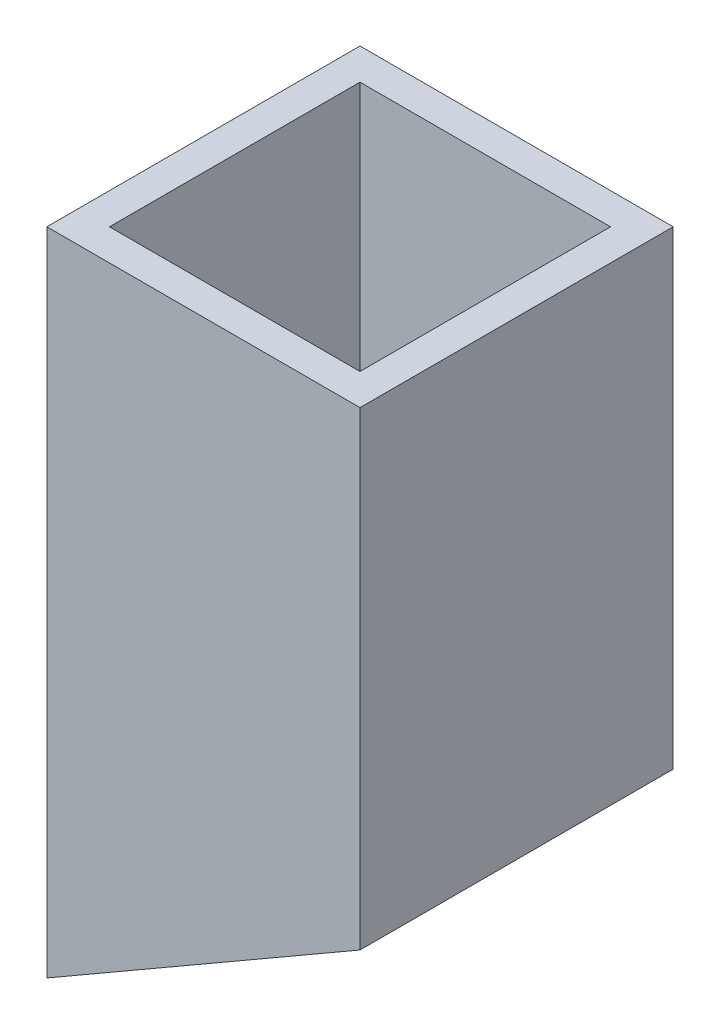
ISO-10303-21;
HEADER;
FILE_DESCRIPTION(('STEP AP214'),'2;1');
FILE_NAME('part.step','',(''),(''),'','','');
FILE_SCHEMA(('AUTOMOTIVE_DESIGN { 1 0 10303 214 1 1 1 1 }'));
ENDSEC;
DATA;
#1=APPLICATION_CONTEXT('core data for automotive mechanical design processes');
#2=APPLICATION_PROTOCOL_DEFINITION('international standard','automotive_design',2000,#1);
#3=PRODUCT_CONTEXT('',#1,'mechanical');
#4=PRODUCT('Part','Part','',(#3));
#5=PRODUCT_RELATED_PRODUCT_CATEGORY('part','',(#4));
#6=PRODUCT_DEFINITION_FORMATION('','',#4);
#7=PRODUCT_DEFINITION_CONTEXT('part definition',#1,'design');
#8=PRODUCT_DEFINITION('design','',#6,#7);
#9=PRODUCT_DEFINITION_SHAPE('','',#8);
#10=(LENGTH_UNIT() NAMED_UNIT(*) SI_UNIT(.MILLI.,.METRE.));
#11=(NAMED_UNIT(*) PLANE_ANGLE_UNIT() SI_UNIT($,.RADIAN.));
#12=(NAMED_UNIT(*) SI_UNIT($,.STERADIAN.) SOLID_ANGLE_UNIT());
#13=UNCERTAINTY_MEASURE_WITH_UNIT(LENGTH_MEASURE(1.E-05),#10,'distance_accuracy_value','');
#14=(GEOMETRIC_REPRESENTATION_CONTEXT(3) GLOBAL_UNCERTAINTY_ASSIGNED_CONTEXT((#13)) GLOBAL_UNIT_ASSIGNED_CONTEXT((#10,
#11,#12)) REPRESENTATION_CONTEXT('',''));
#15=CARTESIAN_POINT('',(0.,0.,0.));
#16=DIRECTION('',(0.,0.,1.));
#17=DIRECTION('',(1.,0.,0.));
#18=AXIS2_PLACEMENT_3D('',#15,#16,#17);
#19=CARTESIAN_POINT('',(0.,150.,0.));
#20=DIRECTION('',(0.,-1.,0.));
#21=DIRECTION('',(0.,0.,-1.));
#22=AXIS2_PLACEMENT_3D('',#19,#20,#21);
#23=PLANE('',#22);
#24=DIRECTION('',(0.,0.,1.));
#25=VECTOR('',#24,1.);
#26=CARTESIAN_POINT('',(0.,150.,0.));
#27=LINE('',#26,#25);
#28=CARTESIAN_POINT('',(0.,150.,-100.));
#29=VERTEX_POINT('',#28);
#30=CARTESIAN_POINT('',(0.,150.,0.));
#31=VERTEX_POINT('',#30);
#32=EDGE_CURVE('E93',#29,#31,#27,.T.);
#33=ORIENTED_EDGE('',*,*,#32,.T.);
#34=DIRECTION('',(1.,0.,0.));
#35=VECTOR('',#34,1.);
#36=CARTESIAN_POINT('',(0.,150.,0.));
#37=LINE('',#36,#35);
#38=CARTESIAN_POINT('',(100.,150.,0.));
#39=VERTEX_POINT('',#38);
#40=EDGE_CURVE('E87',#31,#39,#37,.T.);
#41=ORIENTED_EDGE('',*,*,#40,.T.);
#42=DIRECTION('',(0.,0.,-1.));
#43=VECTOR('',#42,1.);
#44=CARTESIAN_POINT('',(100.,150.,0.));
#45=LINE('',#44,#43);
#46=CARTESIAN_POINT('',(100.,150.,-100.));
#47=VERTEX_POINT('',#46);
#48=EDGE_CURVE('E90',#39,#47,#45,.T.);
#49=ORIENTED_EDGE('',*,*,#48,.T.);
#50=DIRECTION('',(-1.,0.,0.));
#51=VECTOR('',#50,1.);
#52=CARTESIAN_POINT('',(0.,150.,-100.));
#53=LINE('',#52,#51);
#54=EDGE_CURVE('E58',#47,#29,#53,.T.);
#55=ORIENTED_EDGE('',*,*,#54,.T.);
#56=EDGE_LOOP('',(#33,#41,#49,#55));
#57=FACE_BOUND('',#56,.T.);
#58=DIRECTION('',(0.,0.,1.));
#59=VECTOR('',#58,1.);
#60=CARTESIAN_POINT('',(10.,150.,0.));
#61=LINE('',#60,#59);
#62=CARTESIAN_POINT('',(9.99999999999998,150.,-90.));
#63=VERTEX_POINT('',#62);
#64=CARTESIAN_POINT('',(10.,150.,-10.));
#65=VERTEX_POINT('',#64);
#66=EDGE_CURVE('E128',#63,#65,#61,.T.);
#67=ORIENTED_EDGE('',*,*,#66,.F.);
#68=DIRECTION('',(-1.,0.,0.));
#69=VECTOR('',#68,1.);
#70=CARTESIAN_POINT('',(0.,150.,-90.));
#71=LINE('',#70,#69);
#72=CARTESIAN_POINT('',(90.,150.,-90.));
#73=VERTEX_POINT('',#72);
#74=EDGE_CURVE('E120',#73,#63,#71,.T.);
#75=ORIENTED_EDGE('',*,*,#74,.F.);
#76=DIRECTION('',(0.,0.,-1.));
#77=VECTOR('',#76,1.);
#78=CARTESIAN_POINT('',(90.,150.,0.));
#79=LINE('',#78,#77);
#80=CARTESIAN_POINT('',(90.,150.,-10.));
#81=VERTEX_POINT('',#80);
#82=EDGE_CURVE('E123',#81,#73,#79,.T.);
#83=ORIENTED_EDGE('',*,*,#82,.F.);
#84=DIRECTION('',(1.,0.,0.));
#85=VECTOR('',#84,1.);
#86=CARTESIAN_POINT('',(0.,150.,-10.));
#87=LINE('',#86,#85);
#88=EDGE_CURVE('E125',#65,#81,#87,.T.);
#89=ORIENTED_EDGE('',*,*,#88,.F.);
#90=EDGE_LOOP('',(#67,#75,#83,#89));
#91=FACE_BOUND('',#90,.T.);
#92=ADVANCED_FACE('F34',(#57,#91),#23,.F.);
#93=CARTESIAN_POINT('',(0.,150.,0.));
#94=DIRECTION('',(1.,0.,0.));
#95=DIRECTION('',(0.,0.,-1.));
#96=AXIS2_PLACEMENT_3D('',#93,#94,#95);
#97=PLANE('',#96);
#98=DIRECTION('',(0.,-1.,0.));
#99=VECTOR('',#98,1.);
#100=CARTESIAN_POINT('',(0.,150.,-100.));
#101=LINE('',#100,#99);
#102=CARTESIAN_POINT('',(0.,-57.7350269189618,-100.));
#103=VERTEX_POINT('',#102);
#104=EDGE_CURVE('E103',#29,#103,#101,.T.);
#105=ORIENTED_EDGE('',*,*,#104,.T.);
#106=DIRECTION('',(0.,0.,1.));
#107=VECTOR('',#106,1.);
#108=CARTESIAN_POINT('',(0.,-57.7350269189618,-215.470053837925));
#109=LINE('',#108,#107);
#110=CARTESIAN_POINT('',(0.,-57.7350269189618,0.));
#111=VERTEX_POINT('',#110);
#112=EDGE_CURVE('E115',#103,#111,#109,.T.);
#113=ORIENTED_EDGE('',*,*,#112,.T.);
#114=DIRECTION('',(0.,-1.,0.));
#115=VECTOR('',#114,1.);
#116=CARTESIAN_POINT('',(0.,150.,0.));
#117=LINE('',#116,#115);
#118=EDGE_CURVE('E11',#31,#111,#117,.T.);
#119=ORIENTED_EDGE('',*,*,#118,.F.);
#120=ORIENTED_EDGE('',*,*,#32,.F.);
#121=EDGE_LOOP('',(#105,#113,#119,#120));
#122=FACE_BOUND('',#121,.T.);
#123=ADVANCED_FACE('F36',(#122),#97,.F.);
#124=CARTESIAN_POINT('',(0.,150.,0.));
#125=DIRECTION('',(0.,0.,-1.));
#126=DIRECTION('',(-1.,0.,0.));
#127=AXIS2_PLACEMENT_3D('',#124,#125,#126);
#128=PLANE('',#127);
#129=ORIENTED_EDGE('',*,*,#118,.T.);
#130=DIRECTION('',(0.866025403784442,0.499999999999995,0.));
#131=VECTOR('',#130,1.);
#132=CARTESIAN_POINT('',(0.,-57.7350269189618,0.));
#133=LINE('',#132,#131);
#134=CARTESIAN_POINT('',(100.,0.,0.));
#135=VERTEX_POINT('',#134);
#136=EDGE_CURVE('E70',#111,#135,#133,.T.);
#137=ORIENTED_EDGE('',*,*,#136,.T.);
#138=DIRECTION('',(0.,-1.,0.));
#139=VECTOR('',#138,1.);
#140=CARTESIAN_POINT('',(100.,150.,0.));
#141=LINE('',#140,#139);
#142=EDGE_CURVE('E42',#39,#135,#141,.T.);
#143=ORIENTED_EDGE('',*,*,#142,.F.);
#144=ORIENTED_EDGE('',*,*,#40,.F.);
#145=EDGE_LOOP('',(#129,#137,#143,#144));
#146=FACE_BOUND('',#145,.T.);
#147=ADVANCED_FACE('F97',(#146),#128,.F.);
#148=CARTESIAN_POINT('',(100.,150.,0.));
#149=DIRECTION('',(-1.,0.,0.));
#150=DIRECTION('',(0.,0.,1.));
#151=AXIS2_PLACEMENT_3D('',#148,#149,#150);
#152=PLANE('',#151);
#153=DIRECTION('',(0.,0.,-1.));
#154=VECTOR('',#153,1.);
#155=CARTESIAN_POINT('',(100.,0.,0.));
#156=LINE('',#155,#154);
#157=CARTESIAN_POINT('',(100.,0.,-100.));
#158=VERTEX_POINT('',#157);
#159=EDGE_CURVE('E107',#135,#158,#156,.T.);
#160=ORIENTED_EDGE('',*,*,#159,.T.);
#161=DIRECTION('',(0.,-1.,0.));
#162=VECTOR('',#161,1.);
#163=CARTESIAN_POINT('',(100.,150.,-100.));
#164=LINE('',#163,#162);
#165=EDGE_CURVE('E99',#47,#158,#164,.T.);
#166=ORIENTED_EDGE('',*,*,#165,.F.);
#167=ORIENTED_EDGE('',*,*,#48,.F.);
#168=ORIENTED_EDGE('',*,*,#142,.T.);
#169=EDGE_LOOP('',(#160,#166,#167,#168));
#170=FACE_BOUND('',#169,.T.);
#171=ADVANCED_FACE('F100',(#170),#152,.F.);
#172=CARTESIAN_POINT('',(0.,150.,-100.));
#173=DIRECTION('',(0.,0.,1.));
#174=DIRECTION('',(1.,0.,0.));
#175=AXIS2_PLACEMENT_3D('',#172,#173,#174);
#176=PLANE('',#175);
#177=ORIENTED_EDGE('',*,*,#165,.T.);
#178=DIRECTION('',(-0.866025403784442,-0.499999999999995,0.));
#179=VECTOR('',#178,1.);
#180=CARTESIAN_POINT('',(0.,-57.7350269189618,-100.));
#181=LINE('',#180,#179);
#182=EDGE_CURVE('E80',#158,#103,#181,.T.);
#183=ORIENTED_EDGE('',*,*,#182,.T.);
#184=ORIENTED_EDGE('',*,*,#104,.F.);
#185=ORIENTED_EDGE('',*,*,#54,.F.);
#186=EDGE_LOOP('',(#177,#183,#184,#185));
#187=FACE_BOUND('',#186,.T.);
#188=ADVANCED_FACE('F111',(#187),#176,.F.);
#189=CARTESIAN_POINT('',(0.,-57.7350269189618,-215.470053837925));
#190=DIRECTION('',(0.499999999999995,-0.866025403784441,0.));
#191=DIRECTION('',(0.866025403784442,0.499999999999995,0.));
#192=AXIS2_PLACEMENT_3D('',#189,#190,#191);
#193=PLANE('',#192);
#194=ORIENTED_EDGE('',*,*,#182,.F.);
#195=ORIENTED_EDGE('',*,*,#159,.F.);
#196=ORIENTED_EDGE('',*,*,#136,.F.);
#197=ORIENTED_EDGE('',*,*,#112,.F.);
#198=EDGE_LOOP('',(#194,#195,#196,#197));
#199=FACE_BOUND('',#198,.T.);
#200=ADVANCED_FACE('F183',(#199),#193,.T.);
#201=CARTESIAN_POINT('',(10.,150.,0.));
#202=DIRECTION('',(1.,0.,0.));
#203=DIRECTION('',(0.,0.,-1.));
#204=AXIS2_PLACEMENT_3D('',#201,#202,#203);
#205=PLANE('',#204);
#206=DIRECTION('',(0.,-1.,0.));
#207=VECTOR('',#206,1.);
#208=CARTESIAN_POINT('',(9.99999999999998,150.,-90.));
#209=LINE('',#208,#207);
#210=CARTESIAN_POINT('',(9.99999999999998,-40.4145188432732,-90.));
#211=VERTEX_POINT('',#210);
#212=EDGE_CURVE('E122',#63,#211,#209,.T.);
#213=ORIENTED_EDGE('',*,*,#212,.F.);
#214=ORIENTED_EDGE('',*,*,#66,.T.);
#215=DIRECTION('',(0.,-1.,0.));
#216=VECTOR('',#215,1.);
#217=CARTESIAN_POINT('',(10.,150.,-10.));
#218=LINE('',#217,#216);
#219=CARTESIAN_POINT('',(10.,-40.4145188432732,-10.));
#220=VERTEX_POINT('',#219);
#221=EDGE_CURVE('E118',#65,#220,#218,.T.);
#222=ORIENTED_EDGE('',*,*,#221,.T.);
#223=DIRECTION('',(0.,0.,1.));
#224=VECTOR('',#223,1.);
#225=CARTESIAN_POINT('',(9.99999999999994,-40.4145188432732,-215.470053837925));
#226=LINE('',#225,#224);
#227=EDGE_CURVE('E135',#211,#220,#226,.T.);
#228=ORIENTED_EDGE('',*,*,#227,.F.);
#229=EDGE_LOOP('',(#213,#214,#222,#228));
#230=FACE_BOUND('',#229,.T.);
#231=ADVANCED_FACE('F165',(#230),#205,.T.);
#232=CARTESIAN_POINT('',(0.,150.,-10.));
#233=DIRECTION('',(0.,0.,-1.));
#234=DIRECTION('',(-1.,0.,0.));
#235=AXIS2_PLACEMENT_3D('',#232,#233,#234);
#236=PLANE('',#235);
#237=ORIENTED_EDGE('',*,*,#221,.F.);
#238=ORIENTED_EDGE('',*,*,#88,.T.);
#239=DIRECTION('',(0.,-1.,0.));
#240=VECTOR('',#239,1.);
#241=CARTESIAN_POINT('',(90.,150.,-10.));
#242=LINE('',#241,#240);
#243=CARTESIAN_POINT('',(90.,5.77350269189631,-10.));
#244=VERTEX_POINT('',#243);
#245=EDGE_CURVE('E137',#81,#244,#242,.T.);
#246=ORIENTED_EDGE('',*,*,#245,.T.);
#247=DIRECTION('',(0.866025403784442,0.499999999999995,0.));
#248=VECTOR('',#247,1.);
#249=CARTESIAN_POINT('',(-4.99999999999994,-49.0747728811174,-10.));
#250=LINE('',#249,#248);
#251=EDGE_CURVE('E142',#220,#244,#250,.T.);
#252=ORIENTED_EDGE('',*,*,#251,.F.);
#253=EDGE_LOOP('',(#237,#238,#246,#252));
#254=FACE_BOUND('',#253,.T.);
#255=ADVANCED_FACE('F171',(#254),#236,.T.);
#256=CARTESIAN_POINT('',(90.,150.,0.));
#257=DIRECTION('',(-1.,0.,0.));
#258=DIRECTION('',(0.,0.,1.));
#259=AXIS2_PLACEMENT_3D('',#256,#257,#258);
#260=PLANE('',#259);
#261=DIRECTION('',(0.,0.,-1.));
#262=VECTOR('',#261,1.);
#263=CARTESIAN_POINT('',(90.,5.77350269189629,-215.470053837925));
#264=LINE('',#263,#262);
#265=CARTESIAN_POINT('',(90.,5.77350269189629,-90.));
#266=VERTEX_POINT('',#265);
#267=EDGE_CURVE('E131',#244,#266,#264,.T.);
#268=ORIENTED_EDGE('',*,*,#267,.F.);
#269=ORIENTED_EDGE('',*,*,#245,.F.);
#270=ORIENTED_EDGE('',*,*,#82,.T.);
#271=DIRECTION('',(0.,-1.,0.));
#272=VECTOR('',#271,1.);
#273=CARTESIAN_POINT('',(90.,150.,-90.));
#274=LINE('',#273,#272);
#275=EDGE_CURVE('E49',#73,#266,#274,.T.);
#276=ORIENTED_EDGE('',*,*,#275,.T.);
#277=EDGE_LOOP('',(#268,#269,#270,#276));
#278=FACE_BOUND('',#277,.T.);
#279=ADVANCED_FACE('F179',(#278),#260,.T.);
#280=CARTESIAN_POINT('',(0.,150.,-90.));
#281=DIRECTION('',(0.,0.,1.));
#282=DIRECTION('',(1.,0.,0.));
#283=AXIS2_PLACEMENT_3D('',#280,#281,#282);
#284=PLANE('',#283);
#285=ORIENTED_EDGE('',*,*,#275,.F.);
#286=ORIENTED_EDGE('',*,*,#74,.T.);
#287=ORIENTED_EDGE('',*,*,#212,.T.);
#288=DIRECTION('',(-0.866025403784442,-0.499999999999995,0.));
#289=VECTOR('',#288,1.);
#290=CARTESIAN_POINT('',(-4.99999999999994,-49.0747728811174,-90.));
#291=LINE('',#290,#289);
#292=EDGE_CURVE('E132',#266,#211,#291,.T.);
#293=ORIENTED_EDGE('',*,*,#292,.F.);
#294=EDGE_LOOP('',(#285,#286,#287,#293));
#295=FACE_BOUND('',#294,.T.);
#296=ADVANCED_FACE('F152',(#295),#284,.T.);
#297=CARTESIAN_POINT('',(-4.99999999999994,-49.0747728811174,-215.470053837925));
#298=DIRECTION('',(0.499999999999995,-0.866025403784441,0.));
#299=DIRECTION('',(0.866025403784442,0.499999999999995,0.));
#300=AXIS2_PLACEMENT_3D('',#297,#298,#299);
#301=PLANE('',#300);
#302=ORIENTED_EDGE('',*,*,#292,.T.);
#303=ORIENTED_EDGE('',*,*,#227,.T.);
#304=ORIENTED_EDGE('',*,*,#251,.T.);
#305=ORIENTED_EDGE('',*,*,#267,.T.);
#306=EDGE_LOOP('',(#302,#303,#304,#305));
#307=FACE_BOUND('',#306,.T.);
#308=ADVANCED_FACE('F162',(#307),#301,.F.);
#309=CLOSED_SHELL('',(#92,#123,#147,#171,#188,#200,#231,#255,#279,#296,#308));
#310=MANIFOLD_SOLID_BREP('B2',#309);
#311=ADVANCED_BREP_SHAPE_REPRESENTATION('',(#18,#310),#14);
#312=SHAPE_DEFINITION_REPRESENTATION(#9,#311);
ENDSEC;
END-ISO-10303-21;
